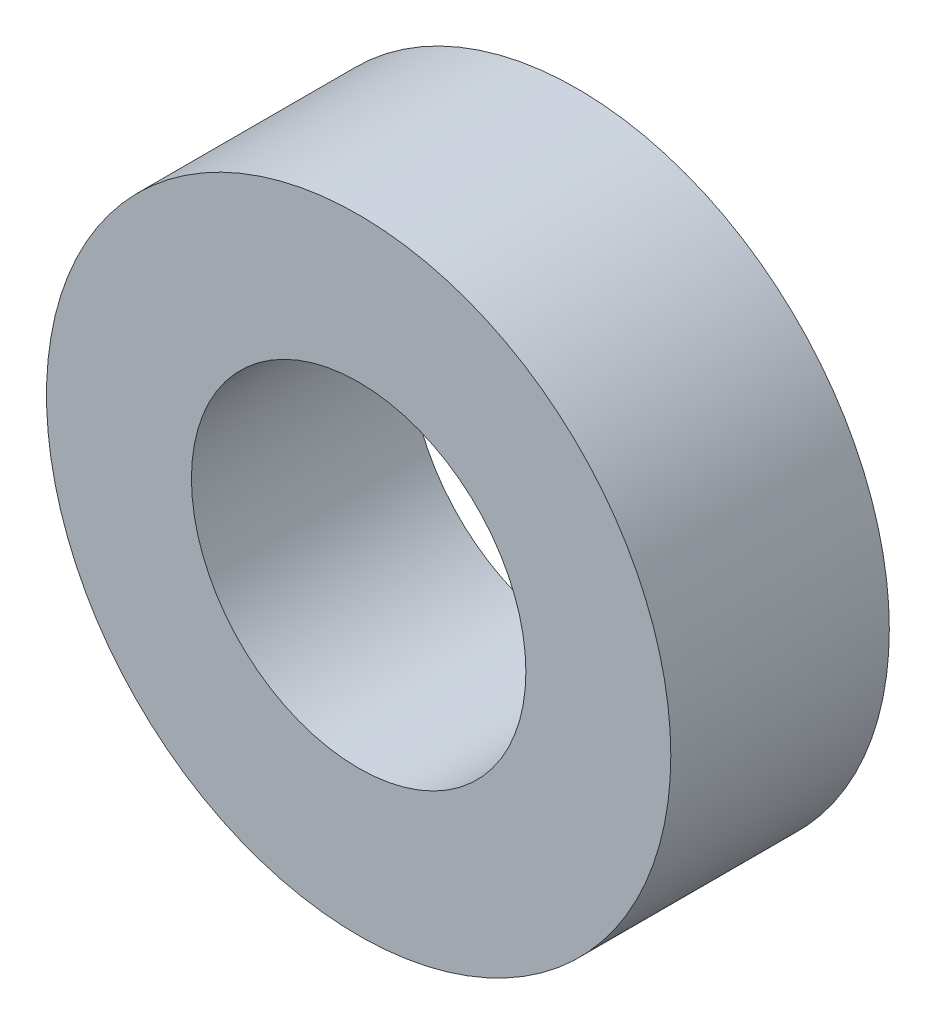
ISO-10303-21;
HEADER;
FILE_DESCRIPTION(('STEP AP214'),'2;1');
FILE_NAME('part.step','',(''),(''),'','','');
FILE_SCHEMA(('AUTOMOTIVE_DESIGN { 1 0 10303 214 1 1 1 1 }'));
ENDSEC;
DATA;
#1=APPLICATION_CONTEXT('core data for automotive mechanical design processes');
#2=APPLICATION_PROTOCOL_DEFINITION('international standard','automotive_design',2000,#1);
#3=PRODUCT_CONTEXT('',#1,'mechanical');
#4=PRODUCT('Part','Part','',(#3));
#5=PRODUCT_RELATED_PRODUCT_CATEGORY('part','',(#4));
#6=PRODUCT_DEFINITION_FORMATION('','',#4);
#7=PRODUCT_DEFINITION_CONTEXT('part definition',#1,'design');
#8=PRODUCT_DEFINITION('design','',#6,#7);
#9=PRODUCT_DEFINITION_SHAPE('','',#8);
#10=(LENGTH_UNIT() NAMED_UNIT(*) SI_UNIT(.MILLI.,.METRE.));
#11=(NAMED_UNIT(*) PLANE_ANGLE_UNIT() SI_UNIT($,.RADIAN.));
#12=(NAMED_UNIT(*) SI_UNIT($,.STERADIAN.) SOLID_ANGLE_UNIT());
#13=UNCERTAINTY_MEASURE_WITH_UNIT(LENGTH_MEASURE(1.E-05),#10,'distance_accuracy_value','');
#14=(GEOMETRIC_REPRESENTATION_CONTEXT(3) GLOBAL_UNCERTAINTY_ASSIGNED_CONTEXT((#13)) GLOBAL_UNIT_ASSIGNED_CONTEXT((#10,
#11,#12)) REPRESENTATION_CONTEXT('',''));
#15=CARTESIAN_POINT('',(0.,0.,0.));
#16=DIRECTION('',(0.,0.,1.));
#17=DIRECTION('',(1.,0.,0.));
#18=AXIS2_PLACEMENT_3D('',#15,#16,#17);
#19=CARTESIAN_POINT('',(0.,0.,3.1115));
#20=DIRECTION('',(0.,0.,1.));
#21=DIRECTION('',(1.,0.,0.));
#22=AXIS2_PLACEMENT_3D('',#19,#20,#21);
#23=PLANE('',#22);
#24=CARTESIAN_POINT('',(0.,0.,3.1115));
#25=DIRECTION('',(0.,0.,1.));
#26=DIRECTION('',(1.,0.,0.));
#27=AXIS2_PLACEMENT_3D('',#24,#25,#26);
#28=CIRCLE('',#27,8.89);
#29=CARTESIAN_POINT('',(8.89,0.,3.1115));
#30=VERTEX_POINT('',#29);
#31=EDGE_CURVE('E10',#30,#30,#28,.T.);
#32=ORIENTED_EDGE('',*,*,#31,.T.);
#33=EDGE_LOOP('',(#32));
#34=FACE_BOUND('',#33,.T.);
#35=CARTESIAN_POINT('',(0.,0.,3.1115));
#36=DIRECTION('',(0.,0.,1.));
#37=DIRECTION('',(1.,0.,0.));
#38=AXIS2_PLACEMENT_3D('',#35,#36,#37);
#39=CIRCLE('',#38,4.7625);
#40=CARTESIAN_POINT('',(4.7625,0.,3.1115));
#41=VERTEX_POINT('',#40);
#42=EDGE_CURVE('E56',#41,#41,#39,.T.);
#43=ORIENTED_EDGE('',*,*,#42,.F.);
#44=EDGE_LOOP('',(#43));
#45=FACE_BOUND('',#44,.T.);
#46=ADVANCED_FACE('F43',(#34,#45),#23,.T.);
#47=CARTESIAN_POINT('',(0.,0.,-3.1115));
#48=DIRECTION('',(0.,0.,1.));
#49=DIRECTION('',(1.,0.,0.));
#50=AXIS2_PLACEMENT_3D('',#47,#48,#49);
#51=PLANE('',#50);
#52=CARTESIAN_POINT('',(0.,0.,-3.1115));
#53=DIRECTION('',(0.,0.,1.));
#54=DIRECTION('',(1.,0.,0.));
#55=AXIS2_PLACEMENT_3D('',#52,#53,#54);
#56=CIRCLE('',#55,8.89);
#57=CARTESIAN_POINT('',(8.89,0.,-3.1115));
#58=VERTEX_POINT('',#57);
#59=EDGE_CURVE('E47',#58,#58,#56,.T.);
#60=ORIENTED_EDGE('',*,*,#59,.F.);
#61=EDGE_LOOP('',(#60));
#62=FACE_BOUND('',#61,.T.);
#63=CARTESIAN_POINT('',(0.,0.,-3.1115));
#64=DIRECTION('',(0.,0.,1.));
#65=DIRECTION('',(1.,0.,0.));
#66=AXIS2_PLACEMENT_3D('',#63,#64,#65);
#67=CIRCLE('',#66,4.7625);
#68=CARTESIAN_POINT('',(4.7625,0.,-3.1115));
#69=VERTEX_POINT('',#68);
#70=EDGE_CURVE('E58',#69,#69,#67,.T.);
#71=ORIENTED_EDGE('',*,*,#70,.T.);
#72=EDGE_LOOP('',(#71));
#73=FACE_BOUND('',#72,.T.);
#74=ADVANCED_FACE('F70',(#62,#73),#51,.F.);
#75=CARTESIAN_POINT('',(0.,0.,3.1115));
#76=DIRECTION('',(0.,0.,-1.));
#77=DIRECTION('',(-1.,0.,0.));
#78=AXIS2_PLACEMENT_3D('',#75,#76,#77);
#79=CYLINDRICAL_SURFACE('',#78,8.89);
#80=ORIENTED_EDGE('',*,*,#31,.F.);
#81=EDGE_LOOP('',(#80));
#82=FACE_BOUND('',#81,.T.);
#83=ORIENTED_EDGE('',*,*,#59,.T.);
#84=EDGE_LOOP('',(#83));
#85=FACE_BOUND('',#84,.T.);
#86=ADVANCED_FACE('F45',(#82,#85),#79,.T.);
#87=CARTESIAN_POINT('',(0.,0.,3.1115));
#88=DIRECTION('',(0.,0.,-1.));
#89=DIRECTION('',(-1.,0.,0.));
#90=AXIS2_PLACEMENT_3D('',#87,#88,#89);
#91=CYLINDRICAL_SURFACE('',#90,4.7625);
#92=ORIENTED_EDGE('',*,*,#42,.T.);
#93=EDGE_LOOP('',(#92));
#94=FACE_BOUND('',#93,.T.);
#95=ORIENTED_EDGE('',*,*,#70,.F.);
#96=EDGE_LOOP('',(#95));
#97=FACE_BOUND('',#96,.T.);
#98=ADVANCED_FACE('F66',(#94,#97),#91,.F.);
#99=CLOSED_SHELL('',(#46,#74,#86,#98));
#100=MANIFOLD_SOLID_BREP('B2',#99);
#101=ADVANCED_BREP_SHAPE_REPRESENTATION('',(#18,#100),#14);
#102=SHAPE_DEFINITION_REPRESENTATION(#9,#101);
ENDSEC;
END-ISO-10303-21;
